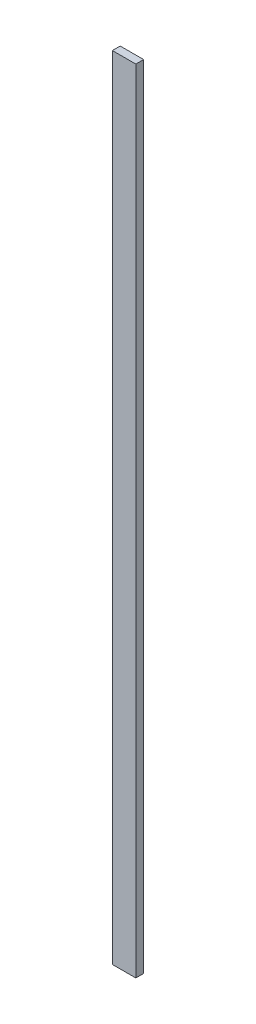
ISO-10303-21;
HEADER;
FILE_DESCRIPTION(('STEP AP214'),'2;1');
FILE_NAME('part.step','',(''),(''),'','','');
FILE_SCHEMA(('AUTOMOTIVE_DESIGN { 1 0 10303 214 1 1 1 1 }'));
ENDSEC;
DATA;
#1=APPLICATION_CONTEXT('core data for automotive mechanical design processes');
#2=APPLICATION_PROTOCOL_DEFINITION('international standard','automotive_design',2000,#1);
#3=PRODUCT_CONTEXT('',#1,'mechanical');
#4=PRODUCT('Part','Part','',(#3));
#5=PRODUCT_RELATED_PRODUCT_CATEGORY('part','',(#4));
#6=PRODUCT_DEFINITION_FORMATION('','',#4);
#7=PRODUCT_DEFINITION_CONTEXT('part definition',#1,'design');
#8=PRODUCT_DEFINITION('design','',#6,#7);
#9=PRODUCT_DEFINITION_SHAPE('','',#8);
#10=(LENGTH_UNIT() NAMED_UNIT(*) SI_UNIT(.MILLI.,.METRE.));
#11=(NAMED_UNIT(*) PLANE_ANGLE_UNIT() SI_UNIT($,.RADIAN.));
#12=(NAMED_UNIT(*) SI_UNIT($,.STERADIAN.) SOLID_ANGLE_UNIT());
#13=UNCERTAINTY_MEASURE_WITH_UNIT(LENGTH_MEASURE(1.E-05),#10,'distance_accuracy_value','');
#14=(GEOMETRIC_REPRESENTATION_CONTEXT(3) GLOBAL_UNCERTAINTY_ASSIGNED_CONTEXT((#13)) GLOBAL_UNIT_ASSIGNED_CONTEXT((#10,
#11,#12)) REPRESENTATION_CONTEXT('',''));
#15=CARTESIAN_POINT('',(0.,0.,0.));
#16=DIRECTION('',(0.,0.,1.));
#17=DIRECTION('',(1.,0.,0.));
#18=AXIS2_PLACEMENT_3D('',#15,#16,#17);
#19=CARTESIAN_POINT('',(-455.,506.285,-10.));
#20=DIRECTION('',(-1.,0.,0.));
#21=DIRECTION('',(0.,-1.,0.));
#22=AXIS2_PLACEMENT_3D('',#19,#20,#21);
#23=PLANE('',#22);
#24=DIRECTION('',(0.,-1.,0.));
#25=VECTOR('',#24,1.);
#26=CARTESIAN_POINT('',(-455.,506.285,0.));
#27=LINE('',#26,#25);
#28=CARTESIAN_POINT('',(-455.,506.285,0.));
#29=VERTEX_POINT('',#28);
#30=CARTESIAN_POINT('',(-455.,-506.285,0.));
#31=VERTEX_POINT('',#30);
#32=EDGE_CURVE('E115',#29,#31,#27,.T.);
#33=ORIENTED_EDGE('',*,*,#32,.F.);
#34=DIRECTION('',(0.,0.,1.));
#35=VECTOR('',#34,1.);
#36=CARTESIAN_POINT('',(-455.,506.285,-10.));
#37=LINE('',#36,#35);
#38=CARTESIAN_POINT('',(-455.,506.285,-10.));
#39=VERTEX_POINT('',#38);
#40=EDGE_CURVE('E11',#39,#29,#37,.T.);
#41=ORIENTED_EDGE('',*,*,#40,.F.);
#42=DIRECTION('',(0.,-1.,0.));
#43=VECTOR('',#42,1.);
#44=CARTESIAN_POINT('',(-455.,506.285,-10.));
#45=LINE('',#44,#43);
#46=CARTESIAN_POINT('',(-455.,-506.285,-10.));
#47=VERTEX_POINT('',#46);
#48=EDGE_CURVE('E107',#39,#47,#45,.T.);
#49=ORIENTED_EDGE('',*,*,#48,.T.);
#50=DIRECTION('',(0.,0.,1.));
#51=VECTOR('',#50,1.);
#52=CARTESIAN_POINT('',(-455.,-506.285,-10.));
#53=LINE('',#52,#51);
#54=EDGE_CURVE('E48',#47,#31,#53,.T.);
#55=ORIENTED_EDGE('',*,*,#54,.T.);
#56=EDGE_LOOP('',(#33,#41,#49,#55));
#57=FACE_BOUND('',#56,.T.);
#58=ADVANCED_FACE('F45',(#57),#23,.T.);
#59=CARTESIAN_POINT('',(-455.,506.285,-10.));
#60=DIRECTION('',(0.,1.,0.));
#61=DIRECTION('',(0.,0.,1.));
#62=AXIS2_PLACEMENT_3D('',#59,#60,#61);
#63=PLANE('',#62);
#64=DIRECTION('',(-1.,0.,0.));
#65=VECTOR('',#64,1.);
#66=CARTESIAN_POINT('',(-455.,506.285,0.));
#67=LINE('',#66,#65);
#68=CARTESIAN_POINT('',(-425.,506.285,0.));
#69=VERTEX_POINT('',#68);
#70=EDGE_CURVE('E110',#69,#29,#67,.T.);
#71=ORIENTED_EDGE('',*,*,#70,.F.);
#72=DIRECTION('',(0.,0.,1.));
#73=VECTOR('',#72,1.);
#74=CARTESIAN_POINT('',(-425.,506.285,-10.));
#75=LINE('',#74,#73);
#76=CARTESIAN_POINT('',(-425.,506.285,-10.));
#77=VERTEX_POINT('',#76);
#78=EDGE_CURVE('E55',#77,#69,#75,.T.);
#79=ORIENTED_EDGE('',*,*,#78,.F.);
#80=DIRECTION('',(-1.,0.,0.));
#81=VECTOR('',#80,1.);
#82=CARTESIAN_POINT('',(-455.,506.285,-10.));
#83=LINE('',#82,#81);
#84=EDGE_CURVE('E102',#77,#39,#83,.T.);
#85=ORIENTED_EDGE('',*,*,#84,.T.);
#86=ORIENTED_EDGE('',*,*,#40,.T.);
#87=EDGE_LOOP('',(#71,#79,#85,#86));
#88=FACE_BOUND('',#87,.T.);
#89=ADVANCED_FACE('F131',(#88),#63,.T.);
#90=CARTESIAN_POINT('',(-425.,506.285,-10.));
#91=DIRECTION('',(1.,0.,0.));
#92=DIRECTION('',(0.,1.,0.));
#93=AXIS2_PLACEMENT_3D('',#90,#91,#92);
#94=PLANE('',#93);
#95=DIRECTION('',(0.,1.,0.));
#96=VECTOR('',#95,1.);
#97=CARTESIAN_POINT('',(-425.,506.285,0.));
#98=LINE('',#97,#96);
#99=CARTESIAN_POINT('',(-425.,-506.285,0.));
#100=VERTEX_POINT('',#99);
#101=EDGE_CURVE('E96',#100,#69,#98,.T.);
#102=ORIENTED_EDGE('',*,*,#101,.F.);
#103=DIRECTION('',(0.,0.,1.));
#104=VECTOR('',#103,1.);
#105=CARTESIAN_POINT('',(-425.,-506.285,-10.));
#106=LINE('',#105,#104);
#107=CARTESIAN_POINT('',(-425.,-506.285,-10.));
#108=VERTEX_POINT('',#107);
#109=EDGE_CURVE('E91',#108,#100,#106,.T.);
#110=ORIENTED_EDGE('',*,*,#109,.F.);
#111=DIRECTION('',(0.,1.,0.));
#112=VECTOR('',#111,1.);
#113=CARTESIAN_POINT('',(-425.,506.285,-10.));
#114=LINE('',#113,#112);
#115=EDGE_CURVE('E94',#108,#77,#114,.T.);
#116=ORIENTED_EDGE('',*,*,#115,.T.);
#117=ORIENTED_EDGE('',*,*,#78,.T.);
#118=EDGE_LOOP('',(#102,#110,#116,#117));
#119=FACE_BOUND('',#118,.T.);
#120=ADVANCED_FACE('F93',(#119),#94,.T.);
#121=CARTESIAN_POINT('',(-455.,-506.285,-10.));
#122=DIRECTION('',(0.,-1.,0.));
#123=DIRECTION('',(1.,0.,0.));
#124=AXIS2_PLACEMENT_3D('',#121,#122,#123);
#125=PLANE('',#124);
#126=DIRECTION('',(1.,0.,0.));
#127=VECTOR('',#126,1.);
#128=CARTESIAN_POINT('',(-455.,-506.285,0.));
#129=LINE('',#128,#127);
#130=EDGE_CURVE('E119',#31,#100,#129,.T.);
#131=ORIENTED_EDGE('',*,*,#130,.F.);
#132=ORIENTED_EDGE('',*,*,#54,.F.);
#133=DIRECTION('',(1.,0.,0.));
#134=VECTOR('',#133,1.);
#135=CARTESIAN_POINT('',(-455.,-506.285,-10.));
#136=LINE('',#135,#134);
#137=EDGE_CURVE('E101',#47,#108,#136,.T.);
#138=ORIENTED_EDGE('',*,*,#137,.T.);
#139=ORIENTED_EDGE('',*,*,#109,.T.);
#140=EDGE_LOOP('',(#131,#132,#138,#139));
#141=FACE_BOUND('',#140,.T.);
#142=ADVANCED_FACE('F105',(#141),#125,.T.);
#143=CARTESIAN_POINT('',(0.,0.,-10.));
#144=DIRECTION('',(0.,0.,1.));
#145=DIRECTION('',(1.,0.,0.));
#146=AXIS2_PLACEMENT_3D('',#143,#144,#145);
#147=PLANE('',#146);
#148=ORIENTED_EDGE('',*,*,#48,.F.);
#149=ORIENTED_EDGE('',*,*,#84,.F.);
#150=ORIENTED_EDGE('',*,*,#115,.F.);
#151=ORIENTED_EDGE('',*,*,#137,.F.);
#152=EDGE_LOOP('',(#148,#149,#150,#151));
#153=FACE_BOUND('',#152,.T.);
#154=ADVANCED_FACE('F100',(#153),#147,.F.);
#155=CARTESIAN_POINT('',(0.,0.,0.));
#156=DIRECTION('',(0.,0.,1.));
#157=DIRECTION('',(1.,0.,0.));
#158=AXIS2_PLACEMENT_3D('',#155,#156,#157);
#159=PLANE('',#158);
#160=ORIENTED_EDGE('',*,*,#32,.T.);
#161=ORIENTED_EDGE('',*,*,#130,.T.);
#162=ORIENTED_EDGE('',*,*,#101,.T.);
#163=ORIENTED_EDGE('',*,*,#70,.T.);
#164=EDGE_LOOP('',(#160,#161,#162,#163));
#165=FACE_BOUND('',#164,.T.);
#166=ADVANCED_FACE('F130',(#165),#159,.T.);
#167=CLOSED_SHELL('',(#58,#89,#120,#142,#154,#166));
#168=MANIFOLD_SOLID_BREP('B2',#167);
#169=ADVANCED_BREP_SHAPE_REPRESENTATION('',(#18,#168),#14);
#170=SHAPE_DEFINITION_REPRESENTATION(#9,#169);
ENDSEC;
END-ISO-10303-21;
